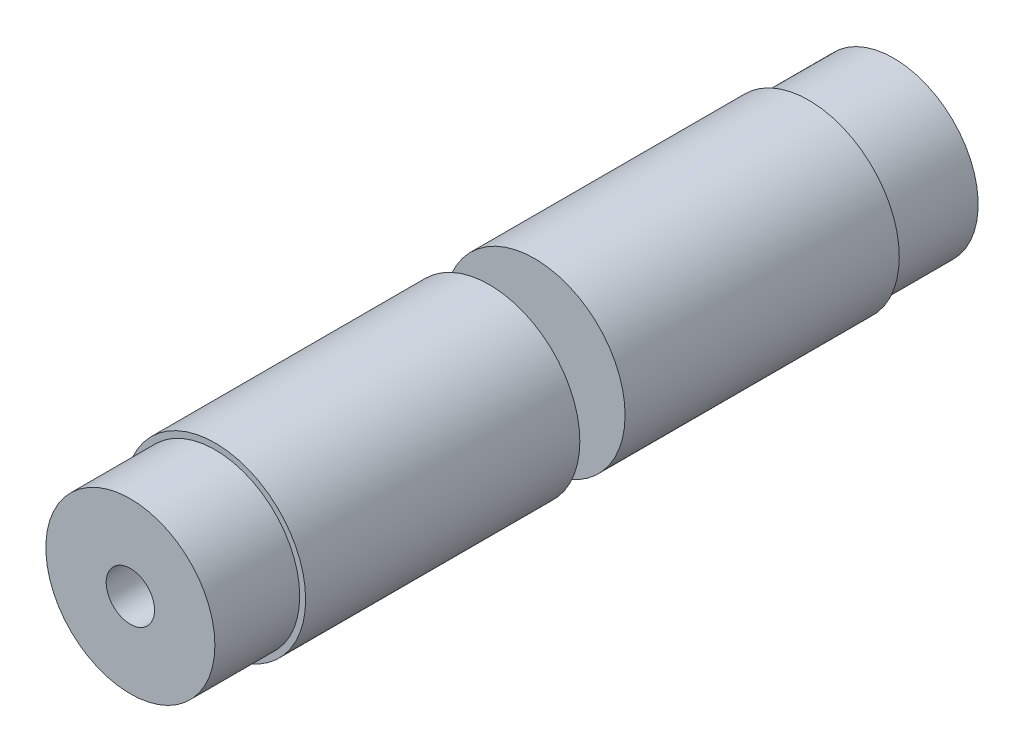
ISO-10303-21;
HEADER;
FILE_DESCRIPTION(('STEP AP214'),'2;1');
FILE_NAME('part.step','',(''),(''),'','','');
FILE_SCHEMA(('AUTOMOTIVE_DESIGN { 1 0 10303 214 1 1 1 1 }'));
ENDSEC;
DATA;
#1=APPLICATION_CONTEXT('core data for automotive mechanical design processes');
#2=APPLICATION_PROTOCOL_DEFINITION('international standard','automotive_design',2000,#1);
#3=PRODUCT_CONTEXT('',#1,'mechanical');
#4=PRODUCT('Part','Part','',(#3));
#5=PRODUCT_RELATED_PRODUCT_CATEGORY('part','',(#4));
#6=PRODUCT_DEFINITION_FORMATION('','',#4);
#7=PRODUCT_DEFINITION_CONTEXT('part definition',#1,'design');
#8=PRODUCT_DEFINITION('design','',#6,#7);
#9=PRODUCT_DEFINITION_SHAPE('','',#8);
#10=(LENGTH_UNIT() NAMED_UNIT(*) SI_UNIT(.MILLI.,.METRE.));
#11=(NAMED_UNIT(*) PLANE_ANGLE_UNIT() SI_UNIT($,.RADIAN.));
#12=(NAMED_UNIT(*) SI_UNIT($,.STERADIAN.) SOLID_ANGLE_UNIT());
#13=UNCERTAINTY_MEASURE_WITH_UNIT(LENGTH_MEASURE(1.E-05),#10,'distance_accuracy_value','');
#14=(GEOMETRIC_REPRESENTATION_CONTEXT(3) GLOBAL_UNCERTAINTY_ASSIGNED_CONTEXT((#13)) GLOBAL_UNIT_ASSIGNED_CONTEXT((#10,
#11,#12)) REPRESENTATION_CONTEXT('',''));
#15=CARTESIAN_POINT('',(0.,0.,0.));
#16=DIRECTION('',(0.,0.,1.));
#17=DIRECTION('',(1.,0.,0.));
#18=AXIS2_PLACEMENT_3D('',#15,#16,#17);
#19=CARTESIAN_POINT('',(0.,0.,105.));
#20=DIRECTION('',(0.,0.,1.));
#21=DIRECTION('',(1.,0.,0.));
#22=AXIS2_PLACEMENT_3D('',#19,#20,#21);
#23=PLANE('',#22);
#24=CARTESIAN_POINT('',(0.,0.,105.));
#25=DIRECTION('',(0.,0.,1.));
#26=DIRECTION('',(1.,0.,0.));
#27=AXIS2_PLACEMENT_3D('',#24,#25,#26);
#28=CIRCLE('',#27,14.95);
#29=CARTESIAN_POINT('',(14.95,0.,105.));
#30=VERTEX_POINT('',#29);
#31=EDGE_CURVE('E60',#30,#30,#28,.T.);
#32=ORIENTED_EDGE('',*,*,#31,.F.);
#33=EDGE_LOOP('',(#32));
#34=FACE_BOUND('',#33,.T.);
#35=CARTESIAN_POINT('',(0.,0.,105.));
#36=DIRECTION('',(0.,0.,1.));
#37=DIRECTION('',(1.,0.,0.));
#38=AXIS2_PLACEMENT_3D('',#35,#36,#37);
#39=CIRCLE('',#38,16.);
#40=CARTESIAN_POINT('',(16.,0.,105.));
#41=VERTEX_POINT('',#40);
#42=EDGE_CURVE('E70',#41,#41,#39,.T.);
#43=ORIENTED_EDGE('',*,*,#42,.T.);
#44=EDGE_LOOP('',(#43));
#45=FACE_BOUND('',#44,.T.);
#46=ADVANCED_FACE('F51',(#34,#45),#23,.T.);
#47=CARTESIAN_POINT('',(0.,0.,105.));
#48=DIRECTION('',(0.,0.,-1.));
#49=DIRECTION('',(-1.,0.,0.));
#50=AXIS2_PLACEMENT_3D('',#47,#48,#49);
#51=CYLINDRICAL_SURFACE('',#50,16.);
#52=CARTESIAN_POINT('',(0.,0.,56.5));
#53=DIRECTION('',(0.,0.,1.));
#54=DIRECTION('',(1.,0.,0.));
#55=AXIS2_PLACEMENT_3D('',#52,#53,#54);
#56=CIRCLE('',#55,16.);
#57=CARTESIAN_POINT('',(16.,0.,56.5));
#58=VERTEX_POINT('',#57);
#59=EDGE_CURVE('E55',#58,#58,#56,.T.);
#60=ORIENTED_EDGE('',*,*,#59,.T.);
#61=EDGE_LOOP('',(#60));
#62=FACE_BOUND('',#61,.T.);
#63=ORIENTED_EDGE('',*,*,#42,.F.);
#64=EDGE_LOOP('',(#63));
#65=FACE_BOUND('',#64,.T.);
#66=ADVANCED_FACE('F84',(#62,#65),#51,.T.);
#67=CARTESIAN_POINT('',(0.,0.,105.));
#68=DIRECTION('',(0.,0.,-1.));
#69=DIRECTION('',(-1.,0.,0.));
#70=AXIS2_PLACEMENT_3D('',#67,#68,#69);
#71=CYLINDRICAL_SURFACE('',#70,4.275);
#72=CARTESIAN_POINT('',(0.,0.,56.5));
#73=DIRECTION('',(0.,0.,1.));
#74=DIRECTION('',(1.,0.,0.));
#75=AXIS2_PLACEMENT_3D('',#72,#73,#74);
#76=CIRCLE('',#75,4.275);
#77=CARTESIAN_POINT('',(4.275,0.,56.5));
#78=VERTEX_POINT('',#77);
#79=EDGE_CURVE('E11',#78,#78,#76,.T.);
#80=ORIENTED_EDGE('',*,*,#79,.F.);
#81=EDGE_LOOP('',(#80));
#82=FACE_BOUND('',#81,.T.);
#83=CARTESIAN_POINT('',(0.,0.,120.));
#84=DIRECTION('',(0.,0.,1.));
#85=DIRECTION('',(1.,0.,0.));
#86=AXIS2_PLACEMENT_3D('',#83,#84,#85);
#87=CIRCLE('',#86,4.275);
#88=CARTESIAN_POINT('',(4.275,0.,120.));
#89=VERTEX_POINT('',#88);
#90=EDGE_CURVE('E75',#89,#89,#87,.T.);
#91=ORIENTED_EDGE('',*,*,#90,.T.);
#92=EDGE_LOOP('',(#91));
#93=FACE_BOUND('',#92,.T.);
#94=ADVANCED_FACE('F53',(#82,#93),#71,.F.);
#95=CARTESIAN_POINT('',(0.,0.,120.));
#96=DIRECTION('',(0.,0.,1.));
#97=DIRECTION('',(1.,0.,0.));
#98=AXIS2_PLACEMENT_3D('',#95,#96,#97);
#99=PLANE('',#98);
#100=CARTESIAN_POINT('',(0.,0.,120.));
#101=DIRECTION('',(0.,0.,1.));
#102=DIRECTION('',(1.,0.,0.));
#103=AXIS2_PLACEMENT_3D('',#100,#101,#102);
#104=CIRCLE('',#103,14.95);
#105=CARTESIAN_POINT('',(14.95,0.,120.));
#106=VERTEX_POINT('',#105);
#107=EDGE_CURVE('E67',#106,#106,#104,.T.);
#108=ORIENTED_EDGE('',*,*,#107,.T.);
#109=EDGE_LOOP('',(#108));
#110=FACE_BOUND('',#109,.T.);
#111=ORIENTED_EDGE('',*,*,#90,.F.);
#112=EDGE_LOOP('',(#111));
#113=FACE_BOUND('',#112,.T.);
#114=ADVANCED_FACE('F93',(#110,#113),#99,.T.);
#115=CARTESIAN_POINT('',(0.,0.,120.));
#116=DIRECTION('',(0.,0.,-1.));
#117=DIRECTION('',(-1.,0.,0.));
#118=AXIS2_PLACEMENT_3D('',#115,#116,#117);
#119=CYLINDRICAL_SURFACE('',#118,14.95);
#120=ORIENTED_EDGE('',*,*,#107,.F.);
#121=EDGE_LOOP('',(#120));
#122=FACE_BOUND('',#121,.T.);
#123=ORIENTED_EDGE('',*,*,#31,.T.);
#124=EDGE_LOOP('',(#123));
#125=FACE_BOUND('',#124,.T.);
#126=ADVANCED_FACE('F89',(#122,#125),#119,.T.);
#127=CARTESIAN_POINT('',(0.,0.,56.5));
#128=DIRECTION('',(0.,0.,1.));
#129=DIRECTION('',(1.,0.,0.));
#130=AXIS2_PLACEMENT_3D('',#127,#128,#129);
#131=PLANE('',#130);
#132=ORIENTED_EDGE('',*,*,#79,.T.);
#133=EDGE_LOOP('',(#132));
#134=FACE_BOUND('',#133,.T.);
#135=ORIENTED_EDGE('',*,*,#59,.F.);
#136=EDGE_LOOP('',(#135));
#137=FACE_BOUND('',#136,.T.);
#138=ADVANCED_FACE('F87',(#134,#137),#131,.F.);
#139=CLOSED_SHELL('',(#46,#66,#94,#114,#126,#138));
#140=MANIFOLD_SOLID_BREP('B2',#139);
#141=CARTESIAN_POINT('',(0.,0.,0.));
#142=DIRECTION('',(0.,0.,1.));
#143=DIRECTION('',(1.,0.,0.));
#144=AXIS2_PLACEMENT_3D('',#141,#142,#143);
#145=PLANE('',#144);
#146=CARTESIAN_POINT('',(0.,0.,0.));
#147=DIRECTION('',(0.,0.,-1.));
#148=DIRECTION('',(-1.,0.,0.));
#149=AXIS2_PLACEMENT_3D('',#146,#147,#148);
#150=CIRCLE('',#149,14.95);
#151=CARTESIAN_POINT('',(-14.95,0.,0.));
#152=VERTEX_POINT('',#151);
#153=EDGE_CURVE('E50',#152,#152,#150,.T.);
#154=ORIENTED_EDGE('',*,*,#153,.F.);
#155=EDGE_LOOP('',(#154));
#156=FACE_BOUND('',#155,.T.);
#157=CARTESIAN_POINT('',(0.,0.,0.));
#158=DIRECTION('',(0.,0.,1.));
#159=DIRECTION('',(1.,0.,0.));
#160=AXIS2_PLACEMENT_3D('',#157,#158,#159);
#161=CIRCLE('',#160,16.);
#162=CARTESIAN_POINT('',(16.,0.,0.));
#163=VERTEX_POINT('',#162);
#164=EDGE_CURVE('E170',#163,#163,#161,.T.);
#165=ORIENTED_EDGE('',*,*,#164,.F.);
#166=EDGE_LOOP('',(#165));
#167=FACE_BOUND('',#166,.T.);
#168=ADVANCED_FACE('F161',(#156,#167),#145,.F.);
#169=CARTESIAN_POINT('',(0.,0.,105.));
#170=DIRECTION('',(0.,0.,-1.));
#171=DIRECTION('',(-1.,0.,0.));
#172=AXIS2_PLACEMENT_3D('',#169,#170,#171);
#173=CYLINDRICAL_SURFACE('',#172,16.);
#174=ORIENTED_EDGE('',*,*,#164,.T.);
#175=EDGE_LOOP('',(#174));
#176=FACE_BOUND('',#175,.T.);
#177=CARTESIAN_POINT('',(0.,0.,48.5));
#178=DIRECTION('',(0.,0.,1.));
#179=DIRECTION('',(1.,0.,0.));
#180=AXIS2_PLACEMENT_3D('',#177,#178,#179);
#181=CIRCLE('',#180,16.);
#182=CARTESIAN_POINT('',(16.,0.,48.5));
#183=VERTEX_POINT('',#182);
#184=EDGE_CURVE('E185',#183,#183,#181,.T.);
#185=ORIENTED_EDGE('',*,*,#184,.F.);
#186=EDGE_LOOP('',(#185));
#187=FACE_BOUND('',#186,.T.);
#188=ADVANCED_FACE('F163',(#176,#187),#173,.T.);
#189=CARTESIAN_POINT('',(0.,0.,-15.));
#190=DIRECTION('',(0.,0.,1.));
#191=DIRECTION('',(1.,0.,0.));
#192=AXIS2_PLACEMENT_3D('',#189,#190,#191);
#193=CYLINDRICAL_SURFACE('',#192,14.95);
#194=CARTESIAN_POINT('',(0.,0.,-15.));
#195=DIRECTION('',(0.,0.,-1.));
#196=DIRECTION('',(-1.,0.,0.));
#197=AXIS2_PLACEMENT_3D('',#194,#195,#196);
#198=CIRCLE('',#197,14.95);
#199=CARTESIAN_POINT('',(-14.95,0.,-15.));
#200=VERTEX_POINT('',#199);
#201=EDGE_CURVE('E176',#200,#200,#198,.T.);
#202=ORIENTED_EDGE('',*,*,#201,.F.);
#203=EDGE_LOOP('',(#202));
#204=FACE_BOUND('',#203,.T.);
#205=ORIENTED_EDGE('',*,*,#153,.T.);
#206=EDGE_LOOP('',(#205));
#207=FACE_BOUND('',#206,.T.);
#208=ADVANCED_FACE('F209',(#204,#207),#193,.T.);
#209=CARTESIAN_POINT('',(0.,0.,-15.));
#210=DIRECTION('',(0.,0.,-1.));
#211=DIRECTION('',(-1.,0.,0.));
#212=AXIS2_PLACEMENT_3D('',#209,#210,#211);
#213=PLANE('',#212);
#214=ORIENTED_EDGE('',*,*,#201,.T.);
#215=EDGE_LOOP('',(#214));
#216=FACE_BOUND('',#215,.T.);
#217=CARTESIAN_POINT('',(0.,0.,-15.));
#218=DIRECTION('',(0.,0.,-1.));
#219=DIRECTION('',(-1.,0.,0.));
#220=AXIS2_PLACEMENT_3D('',#217,#218,#219);
#221=CIRCLE('',#220,4.275);
#222=CARTESIAN_POINT('',(-4.275,0.,-15.));
#223=VERTEX_POINT('',#222);
#224=EDGE_CURVE('E181',#223,#223,#221,.T.);
#225=ORIENTED_EDGE('',*,*,#224,.F.);
#226=EDGE_LOOP('',(#225));
#227=FACE_BOUND('',#226,.T.);
#228=ADVANCED_FACE('F201',(#216,#227),#213,.T.);
#229=CARTESIAN_POINT('',(0.,0.,105.));
#230=DIRECTION('',(0.,0.,-1.));
#231=DIRECTION('',(-1.,0.,0.));
#232=AXIS2_PLACEMENT_3D('',#229,#230,#231);
#233=CYLINDRICAL_SURFACE('',#232,4.275);
#234=ORIENTED_EDGE('',*,*,#224,.T.);
#235=EDGE_LOOP('',(#234));
#236=FACE_BOUND('',#235,.T.);
#237=CARTESIAN_POINT('',(0.,0.,48.5));
#238=DIRECTION('',(0.,0.,1.));
#239=DIRECTION('',(1.,0.,0.));
#240=AXIS2_PLACEMENT_3D('',#237,#238,#239);
#241=CIRCLE('',#240,4.275);
#242=CARTESIAN_POINT('',(4.275,0.,48.5));
#243=VERTEX_POINT('',#242);
#244=EDGE_CURVE('E165',#243,#243,#241,.T.);
#245=ORIENTED_EDGE('',*,*,#244,.T.);
#246=EDGE_LOOP('',(#245));
#247=FACE_BOUND('',#246,.T.);
#248=ADVANCED_FACE('F194',(#236,#247),#233,.F.);
#249=CARTESIAN_POINT('',(0.,0.,48.5));
#250=DIRECTION('',(0.,0.,1.));
#251=DIRECTION('',(1.,0.,0.));
#252=AXIS2_PLACEMENT_3D('',#249,#250,#251);
#253=PLANE('',#252);
#254=ORIENTED_EDGE('',*,*,#244,.F.);
#255=EDGE_LOOP('',(#254));
#256=FACE_BOUND('',#255,.T.);
#257=ORIENTED_EDGE('',*,*,#184,.T.);
#258=EDGE_LOOP('',(#257));
#259=FACE_BOUND('',#258,.T.);
#260=ADVANCED_FACE('F196',(#256,#259),#253,.T.);
#261=CLOSED_SHELL('',(#168,#188,#208,#228,#248,#260));
#262=MANIFOLD_SOLID_BREP('B6',#261);
#263=ADVANCED_BREP_SHAPE_REPRESENTATION('',(#18,#140,#262),#14);
#264=SHAPE_DEFINITION_REPRESENTATION(#9,#263);
ENDSEC;
END-ISO-10303-21;
